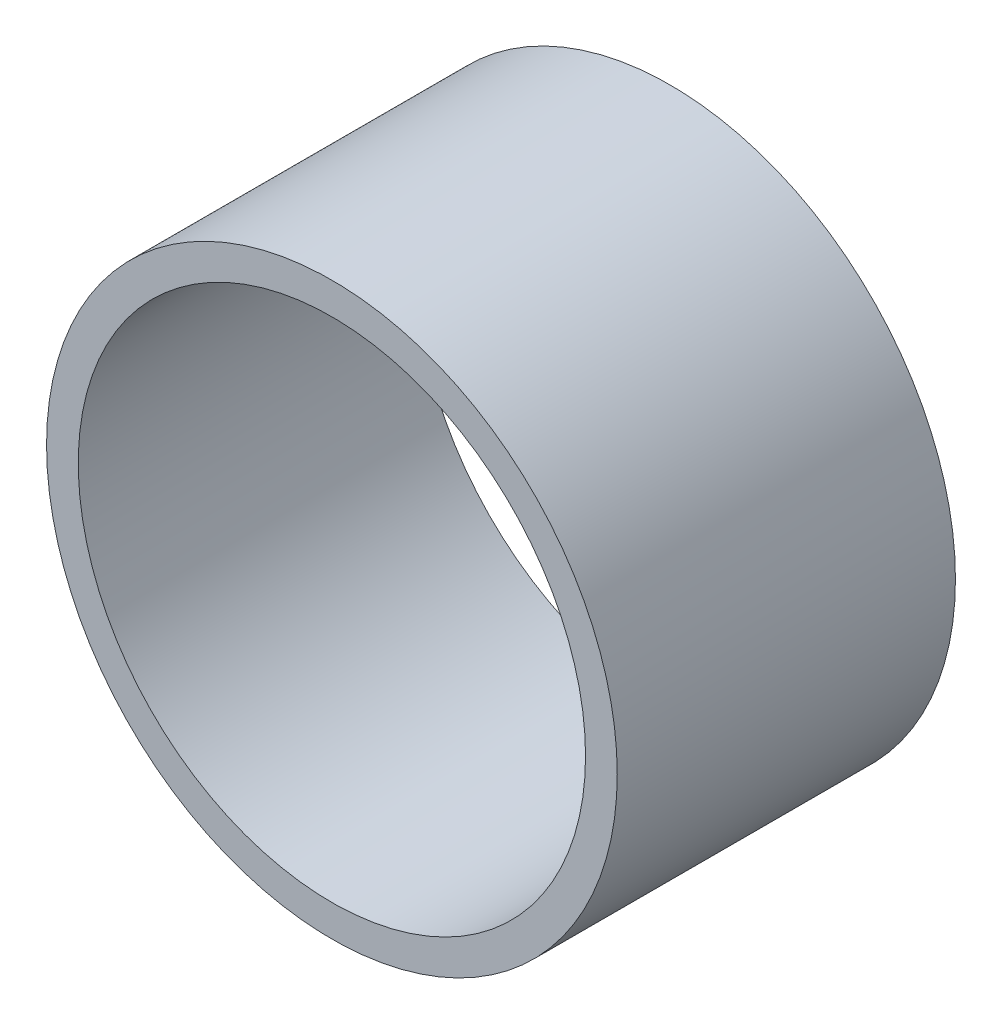
ISO-10303-21;
HEADER;
FILE_DESCRIPTION(('STEP AP214'),'2;1');
FILE_NAME('part.step','',(''),(''),'','','');
FILE_SCHEMA(('AUTOMOTIVE_DESIGN { 1 0 10303 214 1 1 1 1 }'));
ENDSEC;
DATA;
#1=APPLICATION_CONTEXT('core data for automotive mechanical design processes');
#2=APPLICATION_PROTOCOL_DEFINITION('international standard','automotive_design',2000,#1);
#3=PRODUCT_CONTEXT('',#1,'mechanical');
#4=PRODUCT('Part','Part','',(#3));
#5=PRODUCT_RELATED_PRODUCT_CATEGORY('part','',(#4));
#6=PRODUCT_DEFINITION_FORMATION('','',#4);
#7=PRODUCT_DEFINITION_CONTEXT('part definition',#1,'design');
#8=PRODUCT_DEFINITION('design','',#6,#7);
#9=PRODUCT_DEFINITION_SHAPE('','',#8);
#10=(LENGTH_UNIT() NAMED_UNIT(*) SI_UNIT(.MILLI.,.METRE.));
#11=(NAMED_UNIT(*) PLANE_ANGLE_UNIT() SI_UNIT($,.RADIAN.));
#12=(NAMED_UNIT(*) SI_UNIT($,.STERADIAN.) SOLID_ANGLE_UNIT());
#13=UNCERTAINTY_MEASURE_WITH_UNIT(LENGTH_MEASURE(1.E-05),#10,'distance_accuracy_value','');
#14=(GEOMETRIC_REPRESENTATION_CONTEXT(3) GLOBAL_UNCERTAINTY_ASSIGNED_CONTEXT((#13)) GLOBAL_UNIT_ASSIGNED_CONTEXT((#10,
#11,#12)) REPRESENTATION_CONTEXT('',''));
#15=CARTESIAN_POINT('',(0.,0.,0.));
#16=DIRECTION('',(0.,0.,1.));
#17=DIRECTION('',(1.,0.,0.));
#18=AXIS2_PLACEMENT_3D('',#15,#16,#17);
#19=CARTESIAN_POINT('',(0.,0.,40.));
#20=DIRECTION('',(0.,0.,-1.));
#21=DIRECTION('',(-1.,0.,0.));
#22=AXIS2_PLACEMENT_3D('',#19,#20,#21);
#23=CYLINDRICAL_SURFACE('',#22,67.5);
#24=CARTESIAN_POINT('',(0.,0.,40.));
#25=DIRECTION('',(0.,0.,1.));
#26=DIRECTION('',(1.,0.,0.));
#27=AXIS2_PLACEMENT_3D('',#24,#25,#26);
#28=CIRCLE('',#27,67.5);
#29=CARTESIAN_POINT('',(67.5,0.,40.));
#30=VERTEX_POINT('',#29);
#31=EDGE_CURVE('E10',#30,#30,#28,.T.);
#32=ORIENTED_EDGE('',*,*,#31,.F.);
#33=EDGE_LOOP('',(#32));
#34=FACE_BOUND('',#33,.T.);
#35=CARTESIAN_POINT('',(0.,0.,-40.));
#36=DIRECTION('',(0.,0.,1.));
#37=DIRECTION('',(1.,0.,0.));
#38=AXIS2_PLACEMENT_3D('',#35,#36,#37);
#39=CIRCLE('',#38,67.5);
#40=CARTESIAN_POINT('',(67.5,0.,-40.));
#41=VERTEX_POINT('',#40);
#42=EDGE_CURVE('E40',#41,#41,#39,.T.);
#43=ORIENTED_EDGE('',*,*,#42,.T.);
#44=EDGE_LOOP('',(#43));
#45=FACE_BOUND('',#44,.T.);
#46=ADVANCED_FACE('F37',(#34,#45),#23,.T.);
#47=CARTESIAN_POINT('',(0.,0.,40.));
#48=DIRECTION('',(0.,0.,1.));
#49=DIRECTION('',(1.,0.,0.));
#50=AXIS2_PLACEMENT_3D('',#47,#48,#49);
#51=PLANE('',#50);
#52=CARTESIAN_POINT('',(0.,0.,40.));
#53=DIRECTION('',(0.,0.,1.));
#54=DIRECTION('',(1.,0.,0.));
#55=AXIS2_PLACEMENT_3D('',#52,#53,#54);
#56=CIRCLE('',#55,60.);
#57=CARTESIAN_POINT('',(60.,0.,40.));
#58=VERTEX_POINT('',#57);
#59=EDGE_CURVE('E51',#58,#58,#56,.T.);
#60=ORIENTED_EDGE('',*,*,#59,.F.);
#61=EDGE_LOOP('',(#60));
#62=FACE_BOUND('',#61,.T.);
#63=ORIENTED_EDGE('',*,*,#31,.T.);
#64=EDGE_LOOP('',(#63));
#65=FACE_BOUND('',#64,.T.);
#66=ADVANCED_FACE('F68',(#62,#65),#51,.T.);
#67=CARTESIAN_POINT('',(0.,0.,-40.));
#68=DIRECTION('',(0.,0.,1.));
#69=DIRECTION('',(1.,0.,0.));
#70=AXIS2_PLACEMENT_3D('',#67,#68,#69);
#71=PLANE('',#70);
#72=CARTESIAN_POINT('',(0.,0.,-40.));
#73=DIRECTION('',(0.,0.,1.));
#74=DIRECTION('',(1.,0.,0.));
#75=AXIS2_PLACEMENT_3D('',#72,#73,#74);
#76=CIRCLE('',#75,60.);
#77=CARTESIAN_POINT('',(60.,0.,-40.));
#78=VERTEX_POINT('',#77);
#79=EDGE_CURVE('E49',#78,#78,#76,.T.);
#80=ORIENTED_EDGE('',*,*,#79,.T.);
#81=EDGE_LOOP('',(#80));
#82=FACE_BOUND('',#81,.T.);
#83=ORIENTED_EDGE('',*,*,#42,.F.);
#84=EDGE_LOOP('',(#83));
#85=FACE_BOUND('',#84,.T.);
#86=ADVANCED_FACE('F59',(#82,#85),#71,.F.);
#87=CARTESIAN_POINT('',(0.,0.,-40.));
#88=DIRECTION('',(0.,0.,1.));
#89=DIRECTION('',(1.,0.,0.));
#90=AXIS2_PLACEMENT_3D('',#87,#88,#89);
#91=CYLINDRICAL_SURFACE('',#90,60.);
#92=ORIENTED_EDGE('',*,*,#79,.F.);
#93=EDGE_LOOP('',(#92));
#94=FACE_BOUND('',#93,.T.);
#95=ORIENTED_EDGE('',*,*,#59,.T.);
#96=EDGE_LOOP('',(#95));
#97=FACE_BOUND('',#96,.T.);
#98=ADVANCED_FACE('F62',(#94,#97),#91,.F.);
#99=CLOSED_SHELL('',(#46,#66,#86,#98));
#100=MANIFOLD_SOLID_BREP('B2',#99);
#101=ADVANCED_BREP_SHAPE_REPRESENTATION('',(#18,#100),#14);
#102=SHAPE_DEFINITION_REPRESENTATION(#9,#101);
ENDSEC;
END-ISO-10303-21;
